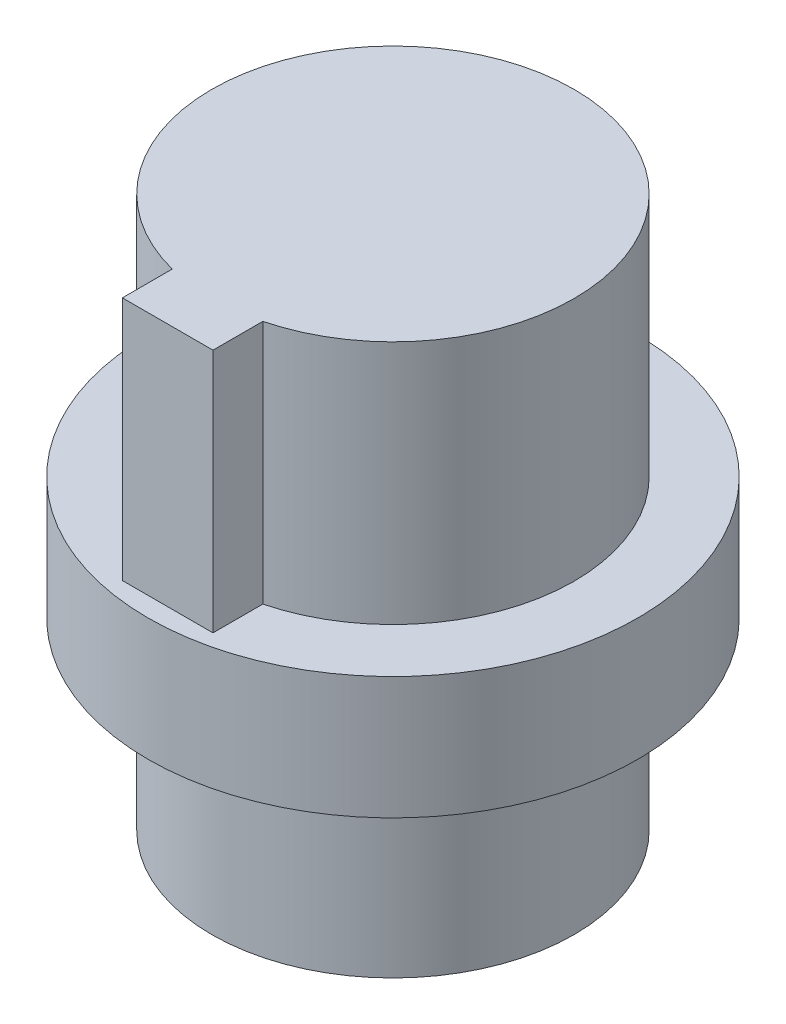
ISO-10303-21;
HEADER;
FILE_DESCRIPTION(('STEP AP214'),'2;1');
FILE_NAME('part.step','',(''),(''),'','','');
FILE_SCHEMA(('AUTOMOTIVE_DESIGN { 1 0 10303 214 1 1 1 1 }'));
ENDSEC;
DATA;
#1=APPLICATION_CONTEXT('core data for automotive mechanical design processes');
#2=APPLICATION_PROTOCOL_DEFINITION('international standard','automotive_design',2000,#1);
#3=PRODUCT_CONTEXT('',#1,'mechanical');
#4=PRODUCT('Part','Part','',(#3));
#5=PRODUCT_RELATED_PRODUCT_CATEGORY('part','',(#4));
#6=PRODUCT_DEFINITION_FORMATION('','',#4);
#7=PRODUCT_DEFINITION_CONTEXT('part definition',#1,'design');
#8=PRODUCT_DEFINITION('design','',#6,#7);
#9=PRODUCT_DEFINITION_SHAPE('','',#8);
#10=(LENGTH_UNIT() NAMED_UNIT(*) SI_UNIT(.MILLI.,.METRE.));
#11=(NAMED_UNIT(*) PLANE_ANGLE_UNIT() SI_UNIT($,.RADIAN.));
#12=(NAMED_UNIT(*) SI_UNIT($,.STERADIAN.) SOLID_ANGLE_UNIT());
#13=UNCERTAINTY_MEASURE_WITH_UNIT(LENGTH_MEASURE(1.E-05),#10,'distance_accuracy_value','');
#14=(GEOMETRIC_REPRESENTATION_CONTEXT(3) GLOBAL_UNCERTAINTY_ASSIGNED_CONTEXT((#13)) GLOBAL_UNIT_ASSIGNED_CONTEXT((#10,
#11,#12)) REPRESENTATION_CONTEXT('',''));
#15=CARTESIAN_POINT('',(0.,0.,0.));
#16=DIRECTION('',(0.,0.,1.));
#17=DIRECTION('',(1.,0.,0.));
#18=AXIS2_PLACEMENT_3D('',#15,#16,#17);
#19=CARTESIAN_POINT('',(0.,9.525,0.));
#20=DIRECTION('',(0.,-1.,0.));
#21=DIRECTION('',(0.,0.,-1.));
#22=AXIS2_PLACEMENT_3D('',#19,#20,#21);
#23=CYLINDRICAL_SURFACE('',#22,9.398);
#24=CARTESIAN_POINT('',(0.,9.525,0.));
#25=DIRECTION('',(0.,1.,0.));
#26=DIRECTION('',(0.,0.,1.));
#27=AXIS2_PLACEMENT_3D('',#24,#25,#26);
#28=CIRCLE('',#27,9.398);
#29=CARTESIAN_POINT('',(0.,9.525,-9.398));
#30=VERTEX_POINT('',#29);
#31=EDGE_CURVE('E52',#30,#30,#28,.T.);
#32=CARTESIAN_POINT('',(0.,0.,0.));
#33=DIRECTION('',(0.,1.,0.));
#34=DIRECTION('',(0.,0.,1.));
#35=AXIS2_PLACEMENT_3D('',#32,#33,#34);
#36=CIRCLE('',#35,9.398);
#37=CARTESIAN_POINT('',(0.,0.,-9.398));
#38=VERTEX_POINT('',#37);
#39=EDGE_CURVE('E46',#38,#38,#36,.T.);
#40=CARTESIAN_POINT('',(0.,9.525,-9.398));
#41=CARTESIAN_POINT('',(0.,9.42578125,-9.398));
#42=CARTESIAN_POINT('',(0.,9.3265625,-9.398));
#43=CARTESIAN_POINT('',(0.,9.128125,-9.398));
#44=CARTESIAN_POINT('',(0.,9.02890625,-9.398));
#45=CARTESIAN_POINT('',(0.,8.83046875,-9.398));
#46=CARTESIAN_POINT('',(0.,8.73125,-9.398));
#47=CARTESIAN_POINT('',(0.,8.5328125,-9.398));
#48=CARTESIAN_POINT('',(0.,8.43359375,-9.398));
#49=CARTESIAN_POINT('',(0.,8.23515625,-9.398));
#50=CARTESIAN_POINT('',(0.,8.1359375,-9.398));
#51=CARTESIAN_POINT('',(0.,7.9375,-9.398));
#52=CARTESIAN_POINT('',(0.,7.83828125,-9.398));
#53=CARTESIAN_POINT('',(0.,7.63984375,-9.398));
#54=CARTESIAN_POINT('',(0.,7.540625,-9.398));
#55=CARTESIAN_POINT('',(0.,7.3421875,-9.398));
#56=CARTESIAN_POINT('',(0.,7.24296875,-9.398));
#57=CARTESIAN_POINT('',(0.,7.04453125,-9.398));
#58=CARTESIAN_POINT('',(0.,6.9453125,-9.398));
#59=CARTESIAN_POINT('',(0.,6.746875,-9.398));
#60=CARTESIAN_POINT('',(0.,6.64765625,-9.398));
#61=CARTESIAN_POINT('',(0.,6.44921875,-9.398));
#62=CARTESIAN_POINT('',(0.,6.35,-9.398));
#63=CARTESIAN_POINT('',(0.,6.1515625,-9.398));
#64=CARTESIAN_POINT('',(0.,6.05234375,-9.398));
#65=CARTESIAN_POINT('',(0.,5.85390625,-9.398));
#66=CARTESIAN_POINT('',(0.,5.7546875,-9.398));
#67=CARTESIAN_POINT('',(0.,5.55625,-9.398));
#68=CARTESIAN_POINT('',(0.,5.45703125,-9.398));
#69=CARTESIAN_POINT('',(0.,5.25859375,-9.398));
#70=CARTESIAN_POINT('',(0.,5.159375,-9.398));
#71=CARTESIAN_POINT('',(0.,4.9609375,-9.398));
#72=CARTESIAN_POINT('',(0.,4.86171875,-9.398));
#73=CARTESIAN_POINT('',(0.,4.66328125,-9.398));
#74=CARTESIAN_POINT('',(0.,4.5640625,-9.398));
#75=CARTESIAN_POINT('',(0.,4.365625,-9.398));
#76=CARTESIAN_POINT('',(0.,4.26640625,-9.398));
#77=CARTESIAN_POINT('',(0.,4.06796875,-9.398));
#78=CARTESIAN_POINT('',(0.,3.96875,-9.398));
#79=CARTESIAN_POINT('',(0.,3.7703125,-9.398));
#80=CARTESIAN_POINT('',(0.,3.67109375,-9.398));
#81=CARTESIAN_POINT('',(0.,3.47265625,-9.398));
#82=CARTESIAN_POINT('',(0.,3.3734375,-9.398));
#83=CARTESIAN_POINT('',(0.,3.175,-9.398));
#84=CARTESIAN_POINT('',(0.,3.07578125,-9.398));
#85=CARTESIAN_POINT('',(0.,2.87734375,-9.398));
#86=CARTESIAN_POINT('',(0.,2.778125,-9.398));
#87=CARTESIAN_POINT('',(0.,2.5796875,-9.398));
#88=CARTESIAN_POINT('',(0.,2.48046875,-9.398));
#89=CARTESIAN_POINT('',(0.,2.28203125,-9.398));
#90=CARTESIAN_POINT('',(0.,2.1828125,-9.398));
#91=CARTESIAN_POINT('',(0.,1.984375,-9.398));
#92=CARTESIAN_POINT('',(0.,1.88515625,-9.398));
#93=CARTESIAN_POINT('',(0.,1.68671875,-9.398));
#94=CARTESIAN_POINT('',(0.,1.5875,-9.398));
#95=CARTESIAN_POINT('',(0.,1.3890625,-9.398));
#96=CARTESIAN_POINT('',(0.,1.28984375,-9.398));
#97=CARTESIAN_POINT('',(0.,1.09140625,-9.398));
#98=CARTESIAN_POINT('',(0.,0.992187500000001,-9.398));
#99=CARTESIAN_POINT('',(0.,0.793750000000001,-9.398));
#100=CARTESIAN_POINT('',(0.,0.69453125,-9.398));
#101=CARTESIAN_POINT('',(0.,0.49609375,-9.398));
#102=CARTESIAN_POINT('',(0.,0.396875,-9.398));
#103=CARTESIAN_POINT('',(0.,0.1984375,-9.398));
#104=CARTESIAN_POINT('',(0.,0.0992187500000001,-9.398));
#105=CARTESIAN_POINT('',(0.,0.,-9.398));
#106=B_SPLINE_CURVE_WITH_KNOTS('',3,(#40,#41,#42,#43,#44,#45,#46,#47,#48,#49,#50,#51,#52,#53,
#54,#55,#56,#57,#58,#59,#60,#61,#62,#63,#64,#65,#66,#67,#68,#69,#70,#71,#72,#73,#74,#75,#76,#77,
#78,#79,#80,#81,#82,#83,#84,#85,#86,#87,#88,#89,#90,#91,#92,#93,#94,#95,#96,#97,#98,#99,#100,
#101,#102,#103,#104,#105),.UNSPECIFIED.,.F.,.F.,(4,2,2,2,2,2,2,2,2,2,2,2,2,2,2,2,2,2,2,2,2,2,2,
2,2,2,2,2,2,2,2,2,4),(0.,0.29765625,0.5953125,0.892968750000001,1.190625,1.48828125,1.7859375,
2.08359375,2.38125,2.67890625,2.9765625,3.27421875,3.571875,3.86953125,4.1671875,4.46484375,
4.7625,5.06015625,5.3578125,5.65546875,5.953125,6.25078125,6.5484375,6.84609375,7.14375,
7.44140625,7.7390625,8.03671875,8.334375,8.63203125,8.9296875,9.22734375,9.525),.UNSPECIFIED.);
#107=EDGE_CURVE('BSEAM43',#30,#38,#106,.T.);
#108=ORIENTED_EDGE('',*,*,#31,.F.);
#109=ORIENTED_EDGE('',*,*,#39,.T.);
#110=ORIENTED_EDGE('',*,*,#107,.T.);
#111=ORIENTED_EDGE('',*,*,#107,.F.);
#112=EDGE_LOOP('',(#108,#110,#109,#111));
#113=FACE_BOUND('',#112,.T.);
#114=ADVANCED_FACE('F43',(#113),#23,.T.);
#115=CARTESIAN_POINT('',(0.,0.,0.));
#116=DIRECTION('',(0.,1.,0.));
#117=DIRECTION('',(0.,0.,1.));
#118=AXIS2_PLACEMENT_3D('',#115,#116,#117);
#119=PLANE('',#118);
#120=ORIENTED_EDGE('',*,*,#39,.F.);
#121=EDGE_LOOP('',(#120));
#122=FACE_BOUND('',#121,.T.);
#123=ADVANCED_FACE('F146',(#122),#119,.F.);
#124=CARTESIAN_POINT('',(0.,15.875,0.));
#125=DIRECTION('',(0.,-1.,0.));
#126=DIRECTION('',(0.,0.,-1.));
#127=AXIS2_PLACEMENT_3D('',#124,#125,#126);
#128=CYLINDRICAL_SURFACE('',#127,12.7);
#129=CARTESIAN_POINT('',(0.,15.875,0.));
#130=DIRECTION('',(0.,1.,0.));
#131=DIRECTION('',(0.,0.,1.));
#132=AXIS2_PLACEMENT_3D('',#129,#130,#131);
#133=CIRCLE('',#132,12.7);
#134=CARTESIAN_POINT('',(0.,15.875,12.7));
#135=VERTEX_POINT('',#134);
#136=EDGE_CURVE('E131',#135,#135,#133,.T.);
#137=ORIENTED_EDGE('',*,*,#136,.F.);
#138=EDGE_LOOP('',(#137));
#139=FACE_BOUND('',#138,.T.);
#140=CARTESIAN_POINT('',(0.,9.525,0.));
#141=DIRECTION('',(0.,1.,0.));
#142=DIRECTION('',(0.,0.,1.));
#143=AXIS2_PLACEMENT_3D('',#140,#141,#142);
#144=CIRCLE('',#143,12.7);
#145=CARTESIAN_POINT('',(0.,9.525,12.7));
#146=VERTEX_POINT('',#145);
#147=EDGE_CURVE('E129',#146,#146,#144,.T.);
#148=ORIENTED_EDGE('',*,*,#147,.T.);
#149=EDGE_LOOP('',(#148));
#150=FACE_BOUND('',#149,.T.);
#151=ADVANCED_FACE('F148',(#139,#150),#128,.T.);
#152=CARTESIAN_POINT('',(0.,15.875,0.));
#153=DIRECTION('',(0.,1.,0.));
#154=DIRECTION('',(0.,0.,1.));
#155=AXIS2_PLACEMENT_3D('',#152,#153,#154);
#156=PLANE('',#155);
#157=DIRECTION('',(0.,0.,1.));
#158=VECTOR('',#157,1.);
#159=CARTESIAN_POINT('',(-2.3495,15.875,-12.701));
#160=LINE('',#159,#158);
#161=CARTESIAN_POINT('',(-2.3495,15.875,9.09957437191433));
#162=VERTEX_POINT('',#161);
#163=CARTESIAN_POINT('',(-2.3495,15.875,11.684));
#164=VERTEX_POINT('',#163);
#165=EDGE_CURVE('E84',#162,#164,#160,.T.);
#166=ORIENTED_EDGE('',*,*,#165,.F.);
#167=CARTESIAN_POINT('',(0.,15.875,0.));
#168=DIRECTION('',(0.,1.,0.));
#169=DIRECTION('',(0.,0.,1.));
#170=AXIS2_PLACEMENT_3D('',#167,#168,#169);
#171=CIRCLE('',#170,9.398);
#172=CARTESIAN_POINT('',(2.3495,15.875,9.09957437191433));
#173=VERTEX_POINT('',#172);
#174=EDGE_CURVE('E11',#173,#162,#171,.T.);
#175=ORIENTED_EDGE('',*,*,#174,.F.);
#176=DIRECTION('',(0.,0.,1.));
#177=VECTOR('',#176,1.);
#178=CARTESIAN_POINT('',(2.3495,15.875,-12.701));
#179=LINE('',#178,#177);
#180=CARTESIAN_POINT('',(2.3495,15.875,11.684));
#181=VERTEX_POINT('',#180);
#182=EDGE_CURVE('E104',#173,#181,#179,.T.);
#183=ORIENTED_EDGE('',*,*,#182,.T.);
#184=DIRECTION('',(1.,0.,0.));
#185=VECTOR('',#184,1.);
#186=CARTESIAN_POINT('',(-2.3495,15.875,11.684));
#187=LINE('',#186,#185);
#188=EDGE_CURVE('E99',#164,#181,#187,.T.);
#189=ORIENTED_EDGE('',*,*,#188,.F.);
#190=EDGE_LOOP('',(#166,#175,#183,#189));
#191=FACE_BOUND('',#190,.T.);
#192=ORIENTED_EDGE('',*,*,#136,.T.);
#193=EDGE_LOOP('',(#192));
#194=FACE_BOUND('',#193,.T.);
#195=ADVANCED_FACE('F106',(#191,#194),#156,.T.);
#196=CARTESIAN_POINT('',(0.,9.525,0.));
#197=DIRECTION('',(0.,1.,0.));
#198=DIRECTION('',(0.,0.,1.));
#199=AXIS2_PLACEMENT_3D('',#196,#197,#198);
#200=PLANE('',#199);
#201=ORIENTED_EDGE('',*,*,#31,.T.);
#202=EDGE_LOOP('',(#201));
#203=FACE_BOUND('',#202,.T.);
#204=ORIENTED_EDGE('',*,*,#147,.F.);
#205=EDGE_LOOP('',(#204));
#206=FACE_BOUND('',#205,.T.);
#207=ADVANCED_FACE('F157',(#203,#206),#200,.F.);
#208=CARTESIAN_POINT('',(0.,28.575,0.));
#209=DIRECTION('',(0.,-1.,0.));
#210=DIRECTION('',(0.,0.,-1.));
#211=AXIS2_PLACEMENT_3D('',#208,#209,#210);
#212=CYLINDRICAL_SURFACE('',#211,9.398);
#213=ORIENTED_EDGE('',*,*,#174,.T.);
#214=DIRECTION('',(0.,-1.,0.));
#215=VECTOR('',#214,1.);
#216=CARTESIAN_POINT('',(-2.3495,28.575,9.09957437191433));
#217=LINE('',#216,#215);
#218=CARTESIAN_POINT('',(-2.3495,28.575,9.09957437191433));
#219=VERTEX_POINT('',#218);
#220=EDGE_CURVE('E89',#219,#162,#217,.T.);
#221=ORIENTED_EDGE('',*,*,#220,.F.);
#222=CARTESIAN_POINT('',(0.,28.575,0.));
#223=DIRECTION('',(0.,1.,0.));
#224=DIRECTION('',(0.,0.,1.));
#225=AXIS2_PLACEMENT_3D('',#222,#223,#224);
#226=CIRCLE('',#225,9.398);
#227=CARTESIAN_POINT('',(2.3495,28.575,9.09957437191433));
#228=VERTEX_POINT('',#227);
#229=EDGE_CURVE('E126',#228,#219,#226,.T.);
#230=ORIENTED_EDGE('',*,*,#229,.F.);
#231=DIRECTION('',(0.,-1.,0.));
#232=VECTOR('',#231,1.);
#233=CARTESIAN_POINT('',(2.3495,28.575,9.09957437191433));
#234=LINE('',#233,#232);
#235=EDGE_CURVE('E60',#173,#228,#234,.F.);
#236=ORIENTED_EDGE('',*,*,#235,.F.);
#237=EDGE_LOOP('',(#213,#221,#230,#236));
#238=FACE_BOUND('',#237,.T.);
#239=ADVANCED_FACE('F160',(#238),#212,.T.);
#240=CARTESIAN_POINT('',(0.,28.575,0.));
#241=DIRECTION('',(0.,1.,0.));
#242=DIRECTION('',(0.,0.,1.));
#243=AXIS2_PLACEMENT_3D('',#240,#241,#242);
#244=PLANE('',#243);
#245=ORIENTED_EDGE('',*,*,#229,.T.);
#246=DIRECTION('',(0.,0.,1.));
#247=VECTOR('',#246,1.);
#248=CARTESIAN_POINT('',(-2.3495,28.575,-12.701));
#249=LINE('',#248,#247);
#250=CARTESIAN_POINT('',(-2.3495,28.575,11.684));
#251=VERTEX_POINT('',#250);
#252=EDGE_CURVE('E69',#219,#251,#249,.T.);
#253=ORIENTED_EDGE('',*,*,#252,.T.);
#254=DIRECTION('',(-1.,0.,0.));
#255=VECTOR('',#254,1.);
#256=CARTESIAN_POINT('',(-2.3495,28.575,11.684));
#257=LINE('',#256,#255);
#258=CARTESIAN_POINT('',(2.3495,28.575,11.684));
#259=VERTEX_POINT('',#258);
#260=EDGE_CURVE('E102',#259,#251,#257,.T.);
#261=ORIENTED_EDGE('',*,*,#260,.F.);
#262=DIRECTION('',(0.,0.,1.));
#263=VECTOR('',#262,1.);
#264=CARTESIAN_POINT('',(2.3495,28.575,-12.701));
#265=LINE('',#264,#263);
#266=EDGE_CURVE('E118',#228,#259,#265,.T.);
#267=ORIENTED_EDGE('',*,*,#266,.F.);
#268=EDGE_LOOP('',(#245,#253,#261,#267));
#269=FACE_BOUND('',#268,.T.);
#270=ADVANCED_FACE('F165',(#269),#244,.T.);
#271=CARTESIAN_POINT('',(-2.3495,15.875,-12.701));
#272=DIRECTION('',(-1.,0.,0.));
#273=DIRECTION('',(0.,0.,1.));
#274=AXIS2_PLACEMENT_3D('',#271,#272,#273);
#275=PLANE('',#274);
#276=ORIENTED_EDGE('',*,*,#252,.F.);
#277=ORIENTED_EDGE('',*,*,#220,.T.);
#278=ORIENTED_EDGE('',*,*,#165,.T.);
#279=DIRECTION('',(0.,-1.,0.));
#280=VECTOR('',#279,1.);
#281=CARTESIAN_POINT('',(-2.3495,15.875,11.684));
#282=LINE('',#281,#280);
#283=EDGE_CURVE('E87',#251,#164,#282,.T.);
#284=ORIENTED_EDGE('',*,*,#283,.F.);
#285=EDGE_LOOP('',(#276,#277,#278,#284));
#286=FACE_BOUND('',#285,.T.);
#287=ADVANCED_FACE('F86',(#286),#275,.T.);
#288=CARTESIAN_POINT('',(2.3495,15.875,-12.701));
#289=DIRECTION('',(1.,0.,0.));
#290=DIRECTION('',(0.,0.,-1.));
#291=AXIS2_PLACEMENT_3D('',#288,#289,#290);
#292=PLANE('',#291);
#293=ORIENTED_EDGE('',*,*,#182,.F.);
#294=ORIENTED_EDGE('',*,*,#235,.T.);
#295=ORIENTED_EDGE('',*,*,#266,.T.);
#296=DIRECTION('',(0.,1.,0.));
#297=VECTOR('',#296,1.);
#298=CARTESIAN_POINT('',(2.3495,15.875,11.684));
#299=LINE('',#298,#297);
#300=EDGE_CURVE('E109',#181,#259,#299,.T.);
#301=ORIENTED_EDGE('',*,*,#300,.F.);
#302=EDGE_LOOP('',(#293,#294,#295,#301));
#303=FACE_BOUND('',#302,.T.);
#304=ADVANCED_FACE('F172',(#303),#292,.T.);
#305=CARTESIAN_POINT('',(0.,0.,11.684));
#306=DIRECTION('',(0.,0.,-1.));
#307=DIRECTION('',(-1.,0.,0.));
#308=AXIS2_PLACEMENT_3D('',#305,#306,#307);
#309=PLANE('',#308);
#310=ORIENTED_EDGE('',*,*,#283,.T.);
#311=ORIENTED_EDGE('',*,*,#188,.T.);
#312=ORIENTED_EDGE('',*,*,#300,.T.);
#313=ORIENTED_EDGE('',*,*,#260,.T.);
#314=EDGE_LOOP('',(#310,#311,#312,#313));
#315=FACE_BOUND('',#314,.T.);
#316=ADVANCED_FACE('F97',(#315),#309,.F.);
#317=CLOSED_SHELL('',(#114,#123,#151,#195,#207,#239,#270,#287,#304,#316));
#318=MANIFOLD_SOLID_BREP('B2',#317);
#319=ADVANCED_BREP_SHAPE_REPRESENTATION('',(#18,#318),#14);
#320=SHAPE_DEFINITION_REPRESENTATION(#9,#319);
ENDSEC;
END-ISO-10303-21;
